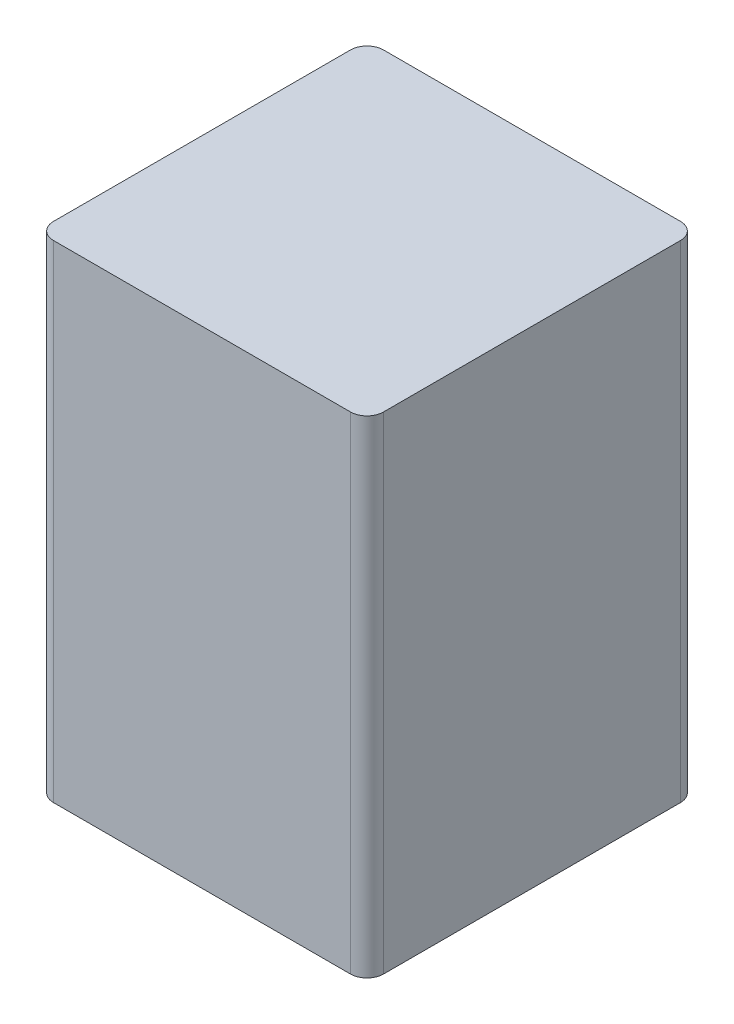
ISO-10303-21;
HEADER;
FILE_DESCRIPTION(('STEP AP214'),'2;1');
FILE_NAME('part.step','',(''),(''),'','','');
FILE_SCHEMA(('AUTOMOTIVE_DESIGN { 1 0 10303 214 1 1 1 1 }'));
ENDSEC;
DATA;
#1=APPLICATION_CONTEXT('core data for automotive mechanical design processes');
#2=APPLICATION_PROTOCOL_DEFINITION('international standard','automotive_design',2000,#1);
#3=PRODUCT_CONTEXT('',#1,'mechanical');
#4=PRODUCT('Part','Part','',(#3));
#5=PRODUCT_RELATED_PRODUCT_CATEGORY('part','',(#4));
#6=PRODUCT_DEFINITION_FORMATION('','',#4);
#7=PRODUCT_DEFINITION_CONTEXT('part definition',#1,'design');
#8=PRODUCT_DEFINITION('design','',#6,#7);
#9=PRODUCT_DEFINITION_SHAPE('','',#8);
#10=(LENGTH_UNIT() NAMED_UNIT(*) SI_UNIT(.MILLI.,.METRE.));
#11=(NAMED_UNIT(*) PLANE_ANGLE_UNIT() SI_UNIT($,.RADIAN.));
#12=(NAMED_UNIT(*) SI_UNIT($,.STERADIAN.) SOLID_ANGLE_UNIT());
#13=UNCERTAINTY_MEASURE_WITH_UNIT(LENGTH_MEASURE(1.E-05),#10,'distance_accuracy_value','');
#14=(GEOMETRIC_REPRESENTATION_CONTEXT(3) GLOBAL_UNCERTAINTY_ASSIGNED_CONTEXT((#13)) GLOBAL_UNIT_ASSIGNED_CONTEXT((#10,
#11,#12)) REPRESENTATION_CONTEXT('',''));
#15=CARTESIAN_POINT('',(0.,0.,0.));
#16=DIRECTION('',(0.,0.,1.));
#17=DIRECTION('',(1.,0.,0.));
#18=AXIS2_PLACEMENT_3D('',#15,#16,#17);
#19=CARTESIAN_POINT('',(-18.6086956521739,59.,-10.304347826087));
#20=DIRECTION('',(0.,-1.,0.));
#21=DIRECTION('',(0.,0.,-1.));
#22=AXIS2_PLACEMENT_3D('',#19,#20,#21);
#23=CYLINDRICAL_SURFACE('',#22,2.);
#24=CARTESIAN_POINT('',(-18.6086956521739,0.,-10.304347826087));
#25=DIRECTION('',(0.,1.,0.));
#26=DIRECTION('',(0.,0.,-1.));
#27=AXIS2_PLACEMENT_3D('',#24,#25,#26);
#28=CIRCLE('',#27,2.);
#29=CARTESIAN_POINT('',(-18.6086956521739,0.,-12.304347826087));
#30=VERTEX_POINT('',#29);
#31=CARTESIAN_POINT('',(-20.6086956521739,0.,-10.3043478260869));
#32=VERTEX_POINT('',#31);
#33=EDGE_CURVE('E129',#30,#32,#28,.T.);
#34=ORIENTED_EDGE('',*,*,#33,.T.);
#35=DIRECTION('',(0.,-1.,0.));
#36=VECTOR('',#35,1.);
#37=CARTESIAN_POINT('',(-20.6086956521739,59.,-10.3043478260869));
#38=LINE('',#37,#36);
#39=CARTESIAN_POINT('',(-20.6086956521739,59.,-10.3043478260869));
#40=VERTEX_POINT('',#39);
#41=EDGE_CURVE('E11',#40,#32,#38,.T.);
#42=ORIENTED_EDGE('',*,*,#41,.F.);
#43=CARTESIAN_POINT('',(-18.6086956521739,59.,-10.304347826087));
#44=DIRECTION('',(0.,1.,0.));
#45=DIRECTION('',(0.,0.,-1.));
#46=AXIS2_PLACEMENT_3D('',#43,#44,#45);
#47=CIRCLE('',#46,2.);
#48=CARTESIAN_POINT('',(-18.6086956521739,59.,-12.304347826087));
#49=VERTEX_POINT('',#48);
#50=EDGE_CURVE('E144',#49,#40,#47,.T.);
#51=ORIENTED_EDGE('',*,*,#50,.F.);
#52=DIRECTION('',(0.,-1.,0.));
#53=VECTOR('',#52,1.);
#54=CARTESIAN_POINT('',(-18.6086956521739,59.,-12.304347826087));
#55=LINE('',#54,#53);
#56=EDGE_CURVE('E125',#49,#30,#55,.T.);
#57=ORIENTED_EDGE('',*,*,#56,.T.);
#58=EDGE_LOOP('',(#34,#42,#51,#57));
#59=FACE_BOUND('',#58,.T.);
#60=ADVANCED_FACE('F33',(#59),#23,.T.);
#61=CARTESIAN_POINT('',(-20.6086956521739,59.,25.695652173913));
#62=DIRECTION('',(1.,0.,0.));
#63=DIRECTION('',(0.,0.,-1.));
#64=AXIS2_PLACEMENT_3D('',#61,#62,#63);
#65=PLANE('',#64);
#66=DIRECTION('',(0.,0.,1.));
#67=VECTOR('',#66,1.);
#68=CARTESIAN_POINT('',(-20.6086956521739,0.,25.695652173913));
#69=LINE('',#68,#67);
#70=CARTESIAN_POINT('',(-20.6086956521739,0.,25.695652173913));
#71=VERTEX_POINT('',#70);
#72=EDGE_CURVE('E132',#32,#71,#69,.T.);
#73=ORIENTED_EDGE('',*,*,#72,.T.);
#74=DIRECTION('',(0.,-1.,0.));
#75=VECTOR('',#74,1.);
#76=CARTESIAN_POINT('',(-20.6086956521739,59.,25.695652173913));
#77=LINE('',#76,#75);
#78=CARTESIAN_POINT('',(-20.6086956521739,59.,25.695652173913));
#79=VERTEX_POINT('',#78);
#80=EDGE_CURVE('E41',#79,#71,#77,.T.);
#81=ORIENTED_EDGE('',*,*,#80,.F.);
#82=DIRECTION('',(0.,0.,1.));
#83=VECTOR('',#82,1.);
#84=CARTESIAN_POINT('',(-20.6086956521739,59.,25.695652173913));
#85=LINE('',#84,#83);
#86=EDGE_CURVE('E92',#40,#79,#85,.T.);
#87=ORIENTED_EDGE('',*,*,#86,.F.);
#88=ORIENTED_EDGE('',*,*,#41,.T.);
#89=EDGE_LOOP('',(#73,#81,#87,#88));
#90=FACE_BOUND('',#89,.T.);
#91=ADVANCED_FACE('F200',(#90),#65,.F.);
#92=CARTESIAN_POINT('',(-18.6086956521739,59.,25.695652173913));
#93=DIRECTION('',(0.,-1.,0.));
#94=DIRECTION('',(0.,0.,-1.));
#95=AXIS2_PLACEMENT_3D('',#92,#93,#94);
#96=CYLINDRICAL_SURFACE('',#95,2.);
#97=CARTESIAN_POINT('',(-18.6086956521739,0.,25.695652173913));
#98=DIRECTION('',(0.,1.,0.));
#99=DIRECTION('',(0.,0.,-1.));
#100=AXIS2_PLACEMENT_3D('',#97,#98,#99);
#101=CIRCLE('',#100,2.);
#102=CARTESIAN_POINT('',(-18.6086956521739,0.,27.695652173913));
#103=VERTEX_POINT('',#102);
#104=EDGE_CURVE('E135',#71,#103,#101,.T.);
#105=ORIENTED_EDGE('',*,*,#104,.T.);
#106=DIRECTION('',(0.,-1.,0.));
#107=VECTOR('',#106,1.);
#108=CARTESIAN_POINT('',(-18.6086956521739,59.,27.695652173913));
#109=LINE('',#108,#107);
#110=CARTESIAN_POINT('',(-18.6086956521739,59.,27.695652173913));
#111=VERTEX_POINT('',#110);
#112=EDGE_CURVE('E151',#111,#103,#109,.T.);
#113=ORIENTED_EDGE('',*,*,#112,.F.);
#114=CARTESIAN_POINT('',(-18.6086956521739,59.,25.695652173913));
#115=DIRECTION('',(0.,1.,0.));
#116=DIRECTION('',(0.,0.,-1.));
#117=AXIS2_PLACEMENT_3D('',#114,#115,#116);
#118=CIRCLE('',#117,2.);
#119=EDGE_CURVE('E159',#79,#111,#118,.T.);
#120=ORIENTED_EDGE('',*,*,#119,.F.);
#121=ORIENTED_EDGE('',*,*,#80,.T.);
#122=EDGE_LOOP('',(#105,#113,#120,#121));
#123=FACE_BOUND('',#122,.T.);
#124=ADVANCED_FACE('F157',(#123),#96,.T.);
#125=CARTESIAN_POINT('',(-18.6086956521739,59.,27.695652173913));
#126=DIRECTION('',(0.,0.,-1.));
#127=DIRECTION('',(-1.,0.,0.));
#128=AXIS2_PLACEMENT_3D('',#125,#126,#127);
#129=PLANE('',#128);
#130=DIRECTION('',(1.,0.,0.));
#131=VECTOR('',#130,1.);
#132=CARTESIAN_POINT('',(-18.6086956521739,0.,27.695652173913));
#133=LINE('',#132,#131);
#134=CARTESIAN_POINT('',(17.3913043478261,0.,27.695652173913));
#135=VERTEX_POINT('',#134);
#136=EDGE_CURVE('E137',#103,#135,#133,.T.);
#137=ORIENTED_EDGE('',*,*,#136,.T.);
#138=DIRECTION('',(0.,-1.,0.));
#139=VECTOR('',#138,1.);
#140=CARTESIAN_POINT('',(17.3913043478261,59.,27.695652173913));
#141=LINE('',#140,#139);
#142=CARTESIAN_POINT('',(17.3913043478261,59.,27.695652173913));
#143=VERTEX_POINT('',#142);
#144=EDGE_CURVE('E148',#143,#135,#141,.T.);
#145=ORIENTED_EDGE('',*,*,#144,.F.);
#146=DIRECTION('',(1.,0.,0.));
#147=VECTOR('',#146,1.);
#148=CARTESIAN_POINT('',(-18.6086956521739,59.,27.695652173913));
#149=LINE('',#148,#147);
#150=EDGE_CURVE('E171',#111,#143,#149,.T.);
#151=ORIENTED_EDGE('',*,*,#150,.F.);
#152=ORIENTED_EDGE('',*,*,#112,.T.);
#153=EDGE_LOOP('',(#137,#145,#151,#152));
#154=FACE_BOUND('',#153,.T.);
#155=ADVANCED_FACE('F167',(#154),#129,.F.);
#156=CARTESIAN_POINT('',(17.3913043478261,59.,25.695652173913));
#157=DIRECTION('',(0.,-1.,0.));
#158=DIRECTION('',(0.,0.,-1.));
#159=AXIS2_PLACEMENT_3D('',#156,#157,#158);
#160=CYLINDRICAL_SURFACE('',#159,2.);
#161=CARTESIAN_POINT('',(17.3913043478261,0.,25.695652173913));
#162=DIRECTION('',(0.,1.,0.));
#163=DIRECTION('',(0.,0.,1.));
#164=AXIS2_PLACEMENT_3D('',#161,#162,#163);
#165=CIRCLE('',#164,2.);
#166=CARTESIAN_POINT('',(19.3913043478261,0.,25.695652173913));
#167=VERTEX_POINT('',#166);
#168=EDGE_CURVE('E139',#135,#167,#165,.T.);
#169=ORIENTED_EDGE('',*,*,#168,.T.);
#170=DIRECTION('',(0.,-1.,0.));
#171=VECTOR('',#170,1.);
#172=CARTESIAN_POINT('',(19.3913043478261,59.,25.695652173913));
#173=LINE('',#172,#171);
#174=CARTESIAN_POINT('',(19.3913043478261,59.,25.695652173913));
#175=VERTEX_POINT('',#174);
#176=EDGE_CURVE('E120',#175,#167,#173,.T.);
#177=ORIENTED_EDGE('',*,*,#176,.F.);
#178=CARTESIAN_POINT('',(17.3913043478261,59.,25.695652173913));
#179=DIRECTION('',(0.,1.,0.));
#180=DIRECTION('',(0.,0.,1.));
#181=AXIS2_PLACEMENT_3D('',#178,#179,#180);
#182=CIRCLE('',#181,2.);
#183=EDGE_CURVE('E111',#143,#175,#182,.T.);
#184=ORIENTED_EDGE('',*,*,#183,.F.);
#185=ORIENTED_EDGE('',*,*,#144,.T.);
#186=EDGE_LOOP('',(#169,#177,#184,#185));
#187=FACE_BOUND('',#186,.T.);
#188=ADVANCED_FACE('F170',(#187),#160,.T.);
#189=CARTESIAN_POINT('',(19.3913043478261,59.,25.695652173913));
#190=DIRECTION('',(-1.,0.,0.));
#191=DIRECTION('',(0.,0.,1.));
#192=AXIS2_PLACEMENT_3D('',#189,#190,#191);
#193=PLANE('',#192);
#194=DIRECTION('',(0.,0.,-1.));
#195=VECTOR('',#194,1.);
#196=CARTESIAN_POINT('',(19.3913043478261,0.,25.695652173913));
#197=LINE('',#196,#195);
#198=CARTESIAN_POINT('',(19.3913043478261,0.,-10.304347826087));
#199=VERTEX_POINT('',#198);
#200=EDGE_CURVE('E119',#167,#199,#197,.T.);
#201=ORIENTED_EDGE('',*,*,#200,.T.);
#202=DIRECTION('',(0.,-1.,0.));
#203=VECTOR('',#202,1.);
#204=CARTESIAN_POINT('',(19.3913043478261,59.,-10.304347826087));
#205=LINE('',#204,#203);
#206=CARTESIAN_POINT('',(19.3913043478261,59.,-10.304347826087));
#207=VERTEX_POINT('',#206);
#208=EDGE_CURVE('E116',#207,#199,#205,.T.);
#209=ORIENTED_EDGE('',*,*,#208,.F.);
#210=DIRECTION('',(0.,0.,-1.));
#211=VECTOR('',#210,1.);
#212=CARTESIAN_POINT('',(19.3913043478261,59.,25.695652173913));
#213=LINE('',#212,#211);
#214=EDGE_CURVE('E105',#175,#207,#213,.T.);
#215=ORIENTED_EDGE('',*,*,#214,.F.);
#216=ORIENTED_EDGE('',*,*,#176,.T.);
#217=EDGE_LOOP('',(#201,#209,#215,#216));
#218=FACE_BOUND('',#217,.T.);
#219=ADVANCED_FACE('F117',(#218),#193,.F.);
#220=CARTESIAN_POINT('',(17.3913043478261,59.,-10.304347826087));
#221=DIRECTION('',(0.,-1.,0.));
#222=DIRECTION('',(0.,0.,-1.));
#223=AXIS2_PLACEMENT_3D('',#220,#221,#222);
#224=CYLINDRICAL_SURFACE('',#223,2.);
#225=CARTESIAN_POINT('',(17.3913043478261,0.,-10.304347826087));
#226=DIRECTION('',(0.,1.,0.));
#227=DIRECTION('',(0.,0.,1.));
#228=AXIS2_PLACEMENT_3D('',#225,#226,#227);
#229=CIRCLE('',#228,2.);
#230=CARTESIAN_POINT('',(17.3913043478261,0.,-12.304347826087));
#231=VERTEX_POINT('',#230);
#232=EDGE_CURVE('E78',#199,#231,#229,.T.);
#233=ORIENTED_EDGE('',*,*,#232,.T.);
#234=DIRECTION('',(0.,-1.,0.));
#235=VECTOR('',#234,1.);
#236=CARTESIAN_POINT('',(17.3913043478261,59.,-12.304347826087));
#237=LINE('',#236,#235);
#238=CARTESIAN_POINT('',(17.3913043478261,59.,-12.304347826087));
#239=VERTEX_POINT('',#238);
#240=EDGE_CURVE('E121',#239,#231,#237,.T.);
#241=ORIENTED_EDGE('',*,*,#240,.F.);
#242=CARTESIAN_POINT('',(17.3913043478261,59.,-10.304347826087));
#243=DIRECTION('',(0.,1.,0.));
#244=DIRECTION('',(0.,0.,1.));
#245=AXIS2_PLACEMENT_3D('',#242,#243,#244);
#246=CIRCLE('',#245,2.);
#247=EDGE_CURVE('E109',#207,#239,#246,.T.);
#248=ORIENTED_EDGE('',*,*,#247,.F.);
#249=ORIENTED_EDGE('',*,*,#208,.T.);
#250=EDGE_LOOP('',(#233,#241,#248,#249));
#251=FACE_BOUND('',#250,.T.);
#252=ADVANCED_FACE('F123',(#251),#224,.T.);
#253=CARTESIAN_POINT('',(-18.6086956521739,59.,-12.304347826087));
#254=DIRECTION('',(0.,0.,1.));
#255=DIRECTION('',(1.,0.,0.));
#256=AXIS2_PLACEMENT_3D('',#253,#254,#255);
#257=PLANE('',#256);
#258=DIRECTION('',(-1.,0.,0.));
#259=VECTOR('',#258,1.);
#260=CARTESIAN_POINT('',(-18.6086956521739,0.,-12.304347826087));
#261=LINE('',#260,#259);
#262=EDGE_CURVE('E84',#231,#30,#261,.T.);
#263=ORIENTED_EDGE('',*,*,#262,.T.);
#264=ORIENTED_EDGE('',*,*,#56,.F.);
#265=DIRECTION('',(-1.,0.,0.));
#266=VECTOR('',#265,1.);
#267=CARTESIAN_POINT('',(-18.6086956521739,59.,-12.304347826087));
#268=LINE('',#267,#266);
#269=EDGE_CURVE('E49',#239,#49,#268,.T.);
#270=ORIENTED_EDGE('',*,*,#269,.F.);
#271=ORIENTED_EDGE('',*,*,#240,.T.);
#272=EDGE_LOOP('',(#263,#264,#270,#271));
#273=FACE_BOUND('',#272,.T.);
#274=ADVANCED_FACE('F196',(#273),#257,.F.);
#275=CARTESIAN_POINT('',(-18.6086956521739,59.,-10.304347826087));
#276=DIRECTION('',(0.,-1.,0.));
#277=DIRECTION('',(0.,0.,-1.));
#278=AXIS2_PLACEMENT_3D('',#275,#276,#277);
#279=PLANE('',#278);
#280=ORIENTED_EDGE('',*,*,#50,.T.);
#281=ORIENTED_EDGE('',*,*,#86,.T.);
#282=ORIENTED_EDGE('',*,*,#119,.T.);
#283=ORIENTED_EDGE('',*,*,#150,.T.);
#284=ORIENTED_EDGE('',*,*,#183,.T.);
#285=ORIENTED_EDGE('',*,*,#214,.T.);
#286=ORIENTED_EDGE('',*,*,#247,.T.);
#287=ORIENTED_EDGE('',*,*,#269,.T.);
#288=EDGE_LOOP('',(#280,#281,#282,#283,#284,#285,#286,#287));
#289=FACE_BOUND('',#288,.T.);
#290=ADVANCED_FACE('F107',(#289),#279,.F.);
#291=CARTESIAN_POINT('',(-18.6086956521739,0.,-10.304347826087));
#292=DIRECTION('',(0.,-1.,0.));
#293=DIRECTION('',(0.,0.,-1.));
#294=AXIS2_PLACEMENT_3D('',#291,#292,#293);
#295=PLANE('',#294);
#296=CARTESIAN_POINT('',(-0.608695652173918,0.,7.69565217391304));
#297=DIRECTION('',(0.,-1.,0.));
#298=DIRECTION('',(0.,0.,-1.));
#299=AXIS2_PLACEMENT_3D('',#296,#297,#298);
#300=CIRCLE('',#299,5.);
#301=CARTESIAN_POINT('',(-0.608695652173918,0.,2.69565217391304));
#302=VERTEX_POINT('',#301);
#303=EDGE_CURVE('E177',#302,#302,#300,.T.);
#304=ORIENTED_EDGE('',*,*,#303,.F.);
#305=EDGE_LOOP('',(#304));
#306=FACE_BOUND('',#305,.T.);
#307=ORIENTED_EDGE('',*,*,#33,.F.);
#308=ORIENTED_EDGE('',*,*,#262,.F.);
#309=ORIENTED_EDGE('',*,*,#232,.F.);
#310=ORIENTED_EDGE('',*,*,#200,.F.);
#311=ORIENTED_EDGE('',*,*,#168,.F.);
#312=ORIENTED_EDGE('',*,*,#136,.F.);
#313=ORIENTED_EDGE('',*,*,#104,.F.);
#314=ORIENTED_EDGE('',*,*,#72,.F.);
#315=EDGE_LOOP('',(#307,#308,#309,#310,#311,#312,#313,#314));
#316=FACE_BOUND('',#315,.T.);
#317=ADVANCED_FACE('F163',(#306,#316),#295,.T.);
#318=CARTESIAN_POINT('',(-0.608695652173918,4.,7.69565217391304));
#319=DIRECTION('',(0.,-1.,0.));
#320=DIRECTION('',(0.,0.,-1.));
#321=AXIS2_PLACEMENT_3D('',#318,#319,#320);
#322=CYLINDRICAL_SURFACE('',#321,5.);
#323=CARTESIAN_POINT('',(-0.608695652173918,4.,7.69565217391304));
#324=DIRECTION('',(0.,-1.,0.));
#325=DIRECTION('',(0.,0.,-1.));
#326=AXIS2_PLACEMENT_3D('',#323,#324,#325);
#327=CIRCLE('',#326,5.);
#328=CARTESIAN_POINT('',(-0.608695652173918,4.,2.69565217391304));
#329=VERTEX_POINT('',#328);
#330=EDGE_CURVE('E133',#329,#329,#327,.T.);
#331=ORIENTED_EDGE('',*,*,#330,.F.);
#332=EDGE_LOOP('',(#331));
#333=FACE_BOUND('',#332,.T.);
#334=ORIENTED_EDGE('',*,*,#303,.T.);
#335=EDGE_LOOP('',(#334));
#336=FACE_BOUND('',#335,.T.);
#337=ADVANCED_FACE('F185',(#333,#336),#322,.F.);
#338=CARTESIAN_POINT('',(-0.608695652173918,4.,7.69565217391304));
#339=DIRECTION('',(0.,-1.,0.));
#340=DIRECTION('',(0.,0.,-1.));
#341=AXIS2_PLACEMENT_3D('',#338,#339,#340);
#342=PLANE('',#341);
#343=ORIENTED_EDGE('',*,*,#330,.T.);
#344=EDGE_LOOP('',(#343));
#345=FACE_BOUND('',#344,.T.);
#346=ADVANCED_FACE('F183',(#345),#342,.T.);
#347=CLOSED_SHELL('',(#60,#91,#124,#155,#188,#219,#252,#274,#290,#317,#337,#346));
#348=MANIFOLD_SOLID_BREP('B2',#347);
#349=ADVANCED_BREP_SHAPE_REPRESENTATION('',(#18,#348),#14);
#350=SHAPE_DEFINITION_REPRESENTATION(#9,#349);
ENDSEC;
END-ISO-10303-21;
